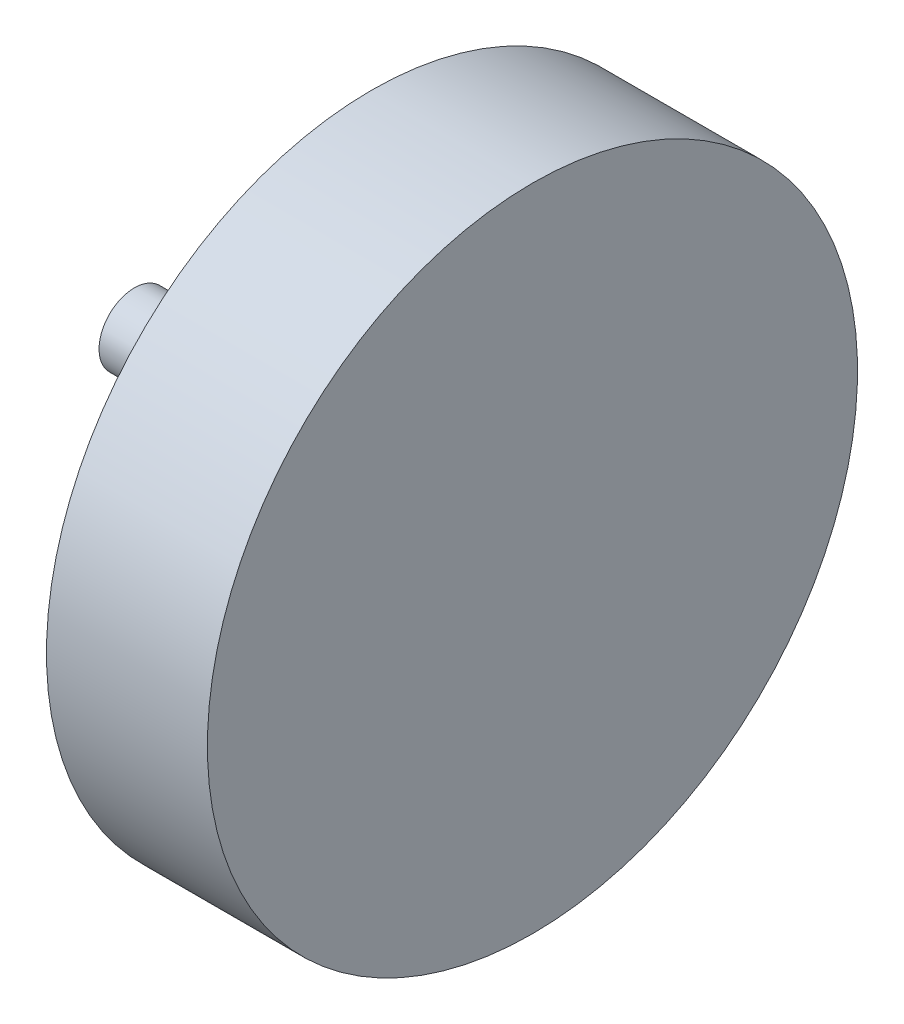
ISO-10303-21;
HEADER;
FILE_DESCRIPTION(('STEP AP214'),'2;1');
FILE_NAME('part.step','',(''),(''),'','','');
FILE_SCHEMA(('AUTOMOTIVE_DESIGN { 1 0 10303 214 1 1 1 1 }'));
ENDSEC;
DATA;
#1=APPLICATION_CONTEXT('core data for automotive mechanical design processes');
#2=APPLICATION_PROTOCOL_DEFINITION('international standard','automotive_design',2000,#1);
#3=PRODUCT_CONTEXT('',#1,'mechanical');
#4=PRODUCT('Part','Part','',(#3));
#5=PRODUCT_RELATED_PRODUCT_CATEGORY('part','',(#4));
#6=PRODUCT_DEFINITION_FORMATION('','',#4);
#7=PRODUCT_DEFINITION_CONTEXT('part definition',#1,'design');
#8=PRODUCT_DEFINITION('design','',#6,#7);
#9=PRODUCT_DEFINITION_SHAPE('','',#8);
#10=(LENGTH_UNIT() NAMED_UNIT(*) SI_UNIT(.MILLI.,.METRE.));
#11=(NAMED_UNIT(*) PLANE_ANGLE_UNIT() SI_UNIT($,.RADIAN.));
#12=(NAMED_UNIT(*) SI_UNIT($,.STERADIAN.) SOLID_ANGLE_UNIT());
#13=UNCERTAINTY_MEASURE_WITH_UNIT(LENGTH_MEASURE(1.E-05),#10,'distance_accuracy_value','');
#14=(GEOMETRIC_REPRESENTATION_CONTEXT(3) GLOBAL_UNCERTAINTY_ASSIGNED_CONTEXT((#13)) GLOBAL_UNIT_ASSIGNED_CONTEXT((#10,
#11,#12)) REPRESENTATION_CONTEXT('',''));
#15=CARTESIAN_POINT('',(0.,0.,0.));
#16=DIRECTION('',(0.,0.,1.));
#17=DIRECTION('',(1.,0.,0.));
#18=AXIS2_PLACEMENT_3D('',#15,#16,#17);
#19=CARTESIAN_POINT('',(187.097045256125,0.,0.));
#20=DIRECTION('',(1.,0.,0.));
#21=DIRECTION('',(0.,1.,0.));
#22=AXIS2_PLACEMENT_3D('',#19,#20,#21);
#23=CONICAL_SURFACE('',#22,42.4636379510022,0.26179938779915);
#24=CARTESIAN_POINT('',(85.4970452561247,0.,0.));
#25=DIRECTION('',(1.,0.,0.));
#26=DIRECTION('',(0.,1.,0.));
#27=AXIS2_PLACEMENT_3D('',#24,#25,#26);
#28=CIRCLE('',#27,15.24);
#29=CARTESIAN_POINT('',(85.4970452561247,15.24,0.));
#30=VERTEX_POINT('',#29);
#31=EDGE_CURVE('E10',#30,#30,#28,.T.);
#32=ORIENTED_EDGE('',*,*,#31,.T.);
#33=EDGE_LOOP('',(#32));
#34=FACE_BOUND('',#33,.T.);
#35=CARTESIAN_POINT('',(187.097045256125,0.,0.));
#36=DIRECTION('',(1.,0.,0.));
#37=DIRECTION('',(0.,1.,0.));
#38=AXIS2_PLACEMENT_3D('',#35,#36,#37);
#39=CIRCLE('',#38,42.4636379510022);
#40=CARTESIAN_POINT('',(187.097045256125,42.4636379510022,0.));
#41=VERTEX_POINT('',#40);
#42=EDGE_CURVE('E76',#41,#41,#39,.T.);
#43=ORIENTED_EDGE('',*,*,#42,.F.);
#44=EDGE_LOOP('',(#43));
#45=FACE_BOUND('',#44,.T.);
#46=ADVANCED_FACE('F49',(#34,#45),#23,.T.);
#47=CARTESIAN_POINT('',(314.097045256125,0.,0.));
#48=DIRECTION('',(1.,0.,0.));
#49=DIRECTION('',(0.,1.,0.));
#50=AXIS2_PLACEMENT_3D('',#47,#48,#49);
#51=CYLINDRICAL_SURFACE('',#50,15.24);
#52=CARTESIAN_POINT('',(72.7970452561247,0.,0.));
#53=DIRECTION('',(1.,0.,0.));
#54=DIRECTION('',(0.,1.,0.));
#55=AXIS2_PLACEMENT_3D('',#52,#53,#54);
#56=CIRCLE('',#55,15.24);
#57=CARTESIAN_POINT('',(72.7970452561247,15.24,0.));
#58=VERTEX_POINT('',#57);
#59=EDGE_CURVE('E55',#58,#58,#56,.T.);
#60=ORIENTED_EDGE('',*,*,#59,.T.);
#61=EDGE_LOOP('',(#60));
#62=FACE_BOUND('',#61,.T.);
#63=ORIENTED_EDGE('',*,*,#31,.F.);
#64=EDGE_LOOP('',(#63));
#65=FACE_BOUND('',#64,.T.);
#66=ADVANCED_FACE('F84',(#62,#65),#51,.T.);
#67=CARTESIAN_POINT('',(72.7970452561247,0.,0.));
#68=DIRECTION('',(-1.,0.,0.));
#69=DIRECTION('',(0.,-1.,0.));
#70=AXIS2_PLACEMENT_3D('',#67,#68,#69);
#71=CONICAL_SURFACE('',#70,15.24,0.5235987755983);
#72=CARTESIAN_POINT('',(50.8,0.,0.));
#73=DIRECTION('',(1.,0.,0.));
#74=DIRECTION('',(0.,1.,0.));
#75=AXIS2_PLACEMENT_3D('',#72,#73,#74);
#76=CIRCLE('',#75,27.94);
#77=CARTESIAN_POINT('',(50.8,27.94,0.));
#78=VERTEX_POINT('',#77);
#79=EDGE_CURVE('E59',#78,#78,#76,.T.);
#80=ORIENTED_EDGE('',*,*,#79,.T.);
#81=EDGE_LOOP('',(#80));
#82=FACE_BOUND('',#81,.T.);
#83=ORIENTED_EDGE('',*,*,#59,.F.);
#84=EDGE_LOOP('',(#83));
#85=FACE_BOUND('',#84,.T.);
#86=ADVANCED_FACE('F88',(#82,#85),#71,.T.);
#87=CARTESIAN_POINT('',(314.097045256125,0.,0.));
#88=DIRECTION('',(1.,0.,0.));
#89=DIRECTION('',(0.,1.,0.));
#90=AXIS2_PLACEMENT_3D('',#87,#88,#89);
#91=CYLINDRICAL_SURFACE('',#90,27.94);
#92=CARTESIAN_POINT('',(0.,0.,0.));
#93=DIRECTION('',(1.,0.,0.));
#94=DIRECTION('',(0.,1.,0.));
#95=AXIS2_PLACEMENT_3D('',#92,#93,#94);
#96=CIRCLE('',#95,27.94);
#97=CARTESIAN_POINT('',(0.,27.94,0.));
#98=VERTEX_POINT('',#97);
#99=EDGE_CURVE('E63',#98,#98,#96,.T.);
#100=ORIENTED_EDGE('',*,*,#99,.T.);
#101=EDGE_LOOP('',(#100));
#102=FACE_BOUND('',#101,.T.);
#103=ORIENTED_EDGE('',*,*,#79,.F.);
#104=EDGE_LOOP('',(#103));
#105=FACE_BOUND('',#104,.T.);
#106=ADVANCED_FACE('F92',(#102,#105),#91,.T.);
#107=CARTESIAN_POINT('',(0.,0.,0.));
#108=DIRECTION('',(-1.,0.,0.));
#109=DIRECTION('',(0.,-1.,0.));
#110=AXIS2_PLACEMENT_3D('',#107,#108,#109);
#111=PLANE('',#110);
#112=ORIENTED_EDGE('',*,*,#99,.F.);
#113=EDGE_LOOP('',(#112));
#114=FACE_BOUND('',#113,.T.);
#115=ADVANCED_FACE('F99',(#114),#111,.T.);
#116=CARTESIAN_POINT('',(314.097045256125,256.54,0.));
#117=DIRECTION('',(1.,0.,0.));
#118=DIRECTION('',(0.,1.,0.));
#119=AXIS2_PLACEMENT_3D('',#116,#117,#118);
#120=PLANE('',#119);
#121=CARTESIAN_POINT('',(314.097045256125,0.,0.));
#122=DIRECTION('',(1.,0.,0.));
#123=DIRECTION('',(0.,1.,0.));
#124=AXIS2_PLACEMENT_3D('',#121,#122,#123);
#125=CIRCLE('',#124,256.54);
#126=CARTESIAN_POINT('',(314.097045256125,256.54,0.));
#127=VERTEX_POINT('',#126);
#128=EDGE_CURVE('E68',#127,#127,#125,.T.);
#129=ORIENTED_EDGE('',*,*,#128,.T.);
#130=EDGE_LOOP('',(#129));
#131=FACE_BOUND('',#130,.T.);
#132=ADVANCED_FACE('F103',(#131),#120,.T.);
#133=CARTESIAN_POINT('',(314.097045256125,0.,0.));
#134=DIRECTION('',(1.,0.,0.));
#135=DIRECTION('',(0.,1.,0.));
#136=AXIS2_PLACEMENT_3D('',#133,#134,#135);
#137=CYLINDRICAL_SURFACE('',#136,256.54);
#138=CARTESIAN_POINT('',(187.097045256125,0.,0.));
#139=DIRECTION('',(1.,0.,0.));
#140=DIRECTION('',(0.,1.,0.));
#141=AXIS2_PLACEMENT_3D('',#138,#139,#140);
#142=CIRCLE('',#141,256.54);
#143=CARTESIAN_POINT('',(187.097045256125,256.54,0.));
#144=VERTEX_POINT('',#143);
#145=EDGE_CURVE('E72',#144,#144,#142,.T.);
#146=ORIENTED_EDGE('',*,*,#145,.T.);
#147=EDGE_LOOP('',(#146));
#148=FACE_BOUND('',#147,.T.);
#149=ORIENTED_EDGE('',*,*,#128,.F.);
#150=EDGE_LOOP('',(#149));
#151=FACE_BOUND('',#150,.T.);
#152=ADVANCED_FACE('F107',(#148,#151),#137,.T.);
#153=CARTESIAN_POINT('',(187.097045256125,42.4636379510022,0.));
#154=DIRECTION('',(-1.,0.,0.));
#155=DIRECTION('',(0.,-1.,0.));
#156=AXIS2_PLACEMENT_3D('',#153,#154,#155);
#157=PLANE('',#156);
#158=ORIENTED_EDGE('',*,*,#42,.T.);
#159=EDGE_LOOP('',(#158));
#160=FACE_BOUND('',#159,.T.);
#161=ORIENTED_EDGE('',*,*,#145,.F.);
#162=EDGE_LOOP('',(#161));
#163=FACE_BOUND('',#162,.T.);
#164=ADVANCED_FACE('F80',(#160,#163),#157,.T.);
#165=CLOSED_SHELL('',(#46,#66,#86,#106,#115,#132,#152,#164));
#166=MANIFOLD_SOLID_BREP('B2',#165);
#167=ADVANCED_BREP_SHAPE_REPRESENTATION('',(#18,#166),#14);
#168=SHAPE_DEFINITION_REPRESENTATION(#9,#167);
ENDSEC;
END-ISO-10303-21;
